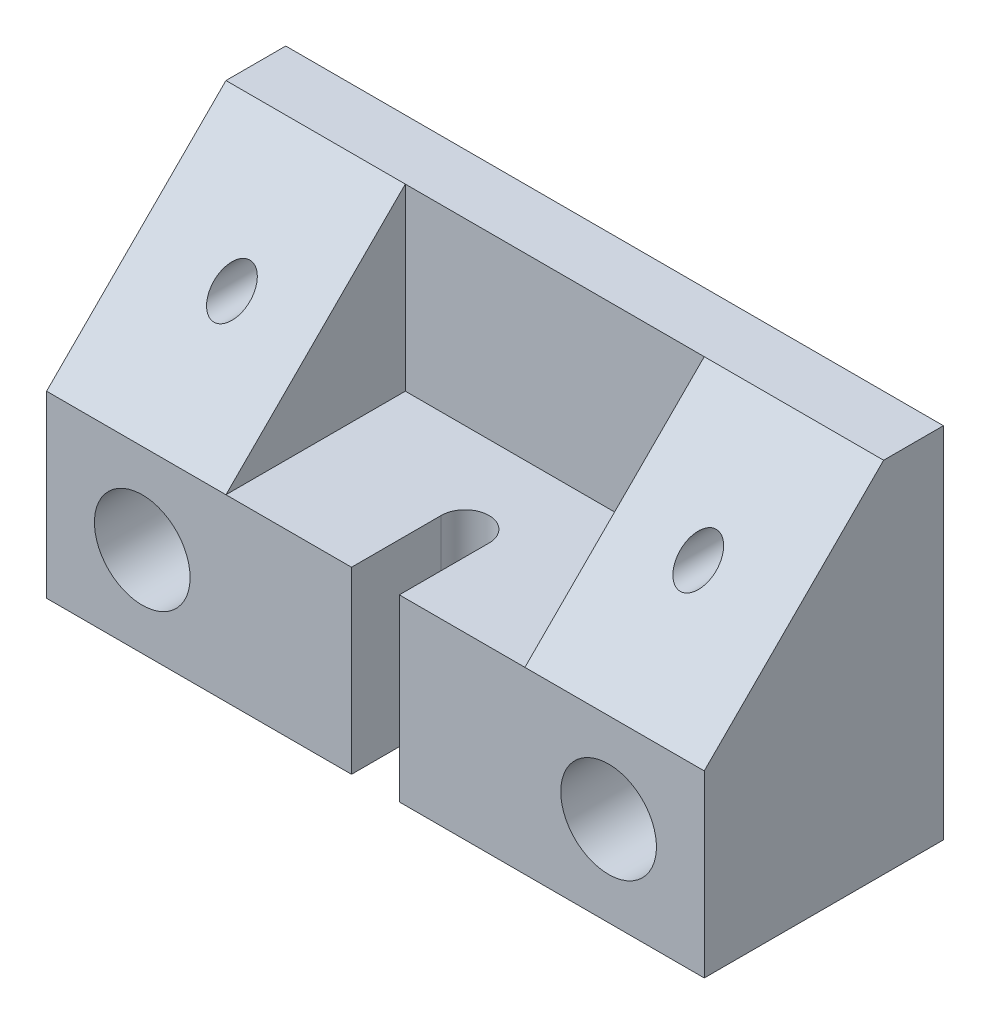
ISO-10303-21;
HEADER;
FILE_DESCRIPTION(('STEP AP214'),'2;1');
FILE_NAME('part.step','',(''),(''),'','','');
FILE_SCHEMA(('AUTOMOTIVE_DESIGN { 1 0 10303 214 1 1 1 1 }'));
ENDSEC;
DATA;
#1=APPLICATION_CONTEXT('core data for automotive mechanical design processes');
#2=APPLICATION_PROTOCOL_DEFINITION('international standard','automotive_design',2000,#1);
#3=PRODUCT_CONTEXT('',#1,'mechanical');
#4=PRODUCT('Part','Part','',(#3));
#5=PRODUCT_RELATED_PRODUCT_CATEGORY('part','',(#4));
#6=PRODUCT_DEFINITION_FORMATION('','',#4);
#7=PRODUCT_DEFINITION_CONTEXT('part definition',#1,'design');
#8=PRODUCT_DEFINITION('design','',#6,#7);
#9=PRODUCT_DEFINITION_SHAPE('','',#8);
#10=(LENGTH_UNIT() NAMED_UNIT(*) SI_UNIT(.MILLI.,.METRE.));
#11=(NAMED_UNIT(*) PLANE_ANGLE_UNIT() SI_UNIT($,.RADIAN.));
#12=(NAMED_UNIT(*) SI_UNIT($,.STERADIAN.) SOLID_ANGLE_UNIT());
#13=UNCERTAINTY_MEASURE_WITH_UNIT(LENGTH_MEASURE(1.E-05),#10,'distance_accuracy_value','');
#14=(GEOMETRIC_REPRESENTATION_CONTEXT(3) GLOBAL_UNCERTAINTY_ASSIGNED_CONTEXT((#13)) GLOBAL_UNIT_ASSIGNED_CONTEXT((#10,
#11,#12)) REPRESENTATION_CONTEXT('',''));
#15=CARTESIAN_POINT('',(0.,0.,0.));
#16=DIRECTION('',(0.,0.,1.));
#17=DIRECTION('',(1.,0.,0.));
#18=AXIS2_PLACEMENT_3D('',#15,#16,#17);
#19=CARTESIAN_POINT('',(0.,0.,0.2));
#20=DIRECTION('',(0.,0.,-1.));
#21=DIRECTION('',(-1.,0.,0.));
#22=AXIS2_PLACEMENT_3D('',#19,#20,#21);
#23=PLANE('',#22);
#24=CARTESIAN_POINT('',(0.0800000000000002,0.0750000000000008,0.2));
#25=DIRECTION('',(0.,0.,1.));
#26=DIRECTION('',(1.,0.,0.));
#27=AXIS2_PLACEMENT_3D('',#24,#25,#26);
#28=CIRCLE('',#27,0.0400000000000005);
#29=CARTESIAN_POINT('',(0.120000000000001,0.0750000000000008,0.2));
#30=VERTEX_POINT('',#29);
#31=EDGE_CURVE('E303',#30,#30,#28,.T.);
#32=ORIENTED_EDGE('',*,*,#31,.F.);
#33=EDGE_LOOP('',(#32));
#34=FACE_BOUND('',#33,.T.);
#35=DIRECTION('',(1.,0.,0.));
#36=VECTOR('',#35,1.);
#37=CARTESIAN_POINT('',(0.,0.,0.2));
#38=LINE('',#37,#36);
#39=CARTESIAN_POINT('',(0.,0.,0.2));
#40=VERTEX_POINT('',#39);
#41=CARTESIAN_POINT('',(0.254999999999999,0.,0.2));
#42=VERTEX_POINT('',#41);
#43=EDGE_CURVE('E197',#40,#42,#38,.T.);
#44=ORIENTED_EDGE('',*,*,#43,.T.);
#45=DIRECTION('',(0.,1.,0.));
#46=VECTOR('',#45,1.);
#47=CARTESIAN_POINT('',(0.254999999999999,0.,0.2));
#48=LINE('',#47,#46);
#49=CARTESIAN_POINT('',(0.254999999999999,0.150000000000002,0.200000000000002));
#50=VERTEX_POINT('',#49);
#51=EDGE_CURVE('E159',#42,#50,#48,.T.);
#52=ORIENTED_EDGE('',*,*,#51,.T.);
#53=DIRECTION('',(1.,0.,0.));
#54=VECTOR('',#53,1.);
#55=CARTESIAN_POINT('',(0.150000000000001,0.150000000000002,0.200000000000002));
#56=LINE('',#55,#54);
#57=CARTESIAN_POINT('',(0.150000000000001,0.150000000000002,0.200000000000002));
#58=VERTEX_POINT('',#57);
#59=EDGE_CURVE('E173',#58,#50,#56,.T.);
#60=ORIENTED_EDGE('',*,*,#59,.F.);
#61=DIRECTION('',(-1.,0.,0.));
#62=VECTOR('',#61,1.);
#63=CARTESIAN_POINT('',(0.551000000000002,0.150000000000002,0.2));
#64=LINE('',#63,#62);
#65=CARTESIAN_POINT('',(0.,0.150000000000002,0.2));
#66=VERTEX_POINT('',#65);
#67=EDGE_CURVE('E188',#58,#66,#64,.T.);
#68=ORIENTED_EDGE('',*,*,#67,.T.);
#69=DIRECTION('',(0.,-1.,0.));
#70=VECTOR('',#69,1.);
#71=CARTESIAN_POINT('',(0.,0.,0.2));
#72=LINE('',#71,#70);
#73=EDGE_CURVE('E194',#66,#40,#72,.T.);
#74=ORIENTED_EDGE('',*,*,#73,.T.);
#75=EDGE_LOOP('',(#44,#52,#60,#68,#74));
#76=FACE_BOUND('',#75,.T.);
#77=ADVANCED_FACE('F37',(#34,#76),#23,.F.);
#78=CARTESIAN_POINT('',(0.551000000000002,0.150000000000002,0.2));
#79=DIRECTION('',(0.,-0.707106781186564,-0.707106781186531));
#80=DIRECTION('',(0.,0.707106781186531,-0.707106781186564));
#81=AXIS2_PLACEMENT_3D('',#78,#79,#80);
#82=PLANE('',#81);
#83=CARTESIAN_POINT('',(0.470000000000002,0.225000000000002,0.124999999999996));
#84=DIRECTION('',(0.,-0.707106781186564,-0.707106781186531));
#85=DIRECTION('',(0.,-0.707106781186531,0.707106781186564));
#86=AXIS2_PLACEMENT_3D('',#83,#84,#85);
#87=ELLIPSE('',#86,0.0212132034355972,0.0150000000000002);
#88=CARTESIAN_POINT('',(0.470000000000002,0.210000000000002,0.139999999999997));
#89=VERTEX_POINT('',#88);
#90=EDGE_CURVE('E152',#89,#89,#87,.T.);
#91=ORIENTED_EDGE('',*,*,#90,.T.);
#92=EDGE_LOOP('',(#91));
#93=FACE_BOUND('',#92,.T.);
#94=DIRECTION('',(-1.,0.,0.));
#95=VECTOR('',#94,1.);
#96=CARTESIAN_POINT('',(0.551000000000002,0.300000000000002,0.0499999999999929));
#97=LINE('',#96,#95);
#98=CARTESIAN_POINT('',(0.55,0.300000000000002,0.0499999999999929));
#99=VERTEX_POINT('',#98);
#100=CARTESIAN_POINT('',(0.400000000000001,0.300000000000002,0.0499999999999929));
#101=VERTEX_POINT('',#100);
#102=EDGE_CURVE('E189',#99,#101,#97,.T.);
#103=ORIENTED_EDGE('',*,*,#102,.T.);
#104=DIRECTION('',(0.,-0.707106781186531,0.707106781186564));
#105=VECTOR('',#104,1.);
#106=CARTESIAN_POINT('',(0.400000000000001,0.150000000000002,0.2));
#107=LINE('',#106,#105);
#108=CARTESIAN_POINT('',(0.400000000000001,0.150000000000002,0.200000000000002));
#109=VERTEX_POINT('',#108);
#110=EDGE_CURVE('E46',#101,#109,#107,.T.);
#111=ORIENTED_EDGE('',*,*,#110,.T.);
#112=CARTESIAN_POINT('',(0.550000000000002,0.150000000000002,0.2));
#113=VERTEX_POINT('',#112);
#114=EDGE_CURVE('E184',#113,#109,#64,.T.);
#115=ORIENTED_EDGE('',*,*,#114,.F.);
#116=DIRECTION('',(0.,0.707106781186531,-0.707106781186564));
#117=VECTOR('',#116,1.);
#118=CARTESIAN_POINT('',(0.550000000000001,0.150000000000002,0.2));
#119=LINE('',#118,#117);
#120=EDGE_CURVE('E187',#113,#99,#119,.T.);
#121=ORIENTED_EDGE('',*,*,#120,.T.);
#122=EDGE_LOOP('',(#103,#111,#115,#121));
#123=FACE_BOUND('',#122,.T.);
#124=ADVANCED_FACE('F227',(#93,#123),#82,.F.);
#125=CARTESIAN_POINT('',(0.,0.,0.2));
#126=DIRECTION('',(1.,0.,0.));
#127=DIRECTION('',(0.,0.,-1.));
#128=AXIS2_PLACEMENT_3D('',#125,#126,#127);
#129=PLANE('',#128);
#130=ORIENTED_EDGE('',*,*,#73,.F.);
#131=DIRECTION('',(0.,-0.707106781186531,0.707106781186564));
#132=VECTOR('',#131,1.);
#133=CARTESIAN_POINT('',(0.,0.150000000000002,0.2));
#134=LINE('',#133,#132);
#135=CARTESIAN_POINT('',(0.,0.300000000000002,0.0499999999999929));
#136=VERTEX_POINT('',#135);
#137=EDGE_CURVE('E179',#136,#66,#134,.T.);
#138=ORIENTED_EDGE('',*,*,#137,.F.);
#139=DIRECTION('',(0.,0.,-1.));
#140=VECTOR('',#139,1.);
#141=CARTESIAN_POINT('',(0.,0.300000000000002,0.2));
#142=LINE('',#141,#140);
#143=CARTESIAN_POINT('',(0.,0.300000000000002,0.));
#144=VERTEX_POINT('',#143);
#145=EDGE_CURVE('E203',#136,#144,#142,.T.);
#146=ORIENTED_EDGE('',*,*,#145,.T.);
#147=DIRECTION('',(0.,-1.,0.));
#148=VECTOR('',#147,1.);
#149=CARTESIAN_POINT('',(0.,0.,0.));
#150=LINE('',#149,#148);
#151=CARTESIAN_POINT('',(0.,0.,0.));
#152=VERTEX_POINT('',#151);
#153=EDGE_CURVE('E193',#144,#152,#150,.T.);
#154=ORIENTED_EDGE('',*,*,#153,.T.);
#155=DIRECTION('',(0.,0.,-1.));
#156=VECTOR('',#155,1.);
#157=CARTESIAN_POINT('',(0.,0.,0.2));
#158=LINE('',#157,#156);
#159=EDGE_CURVE('E219',#40,#152,#158,.T.);
#160=ORIENTED_EDGE('',*,*,#159,.F.);
#161=EDGE_LOOP('',(#130,#138,#146,#154,#160));
#162=FACE_BOUND('',#161,.T.);
#163=ADVANCED_FACE('F39',(#162),#129,.F.);
#164=CARTESIAN_POINT('',(0.,0.,0.2));
#165=DIRECTION('',(0.,1.,0.));
#166=DIRECTION('',(0.,0.,1.));
#167=AXIS2_PLACEMENT_3D('',#164,#165,#166);
#168=PLANE('',#167);
#169=CARTESIAN_POINT('',(0.274999999999999,0.,0.125000000000002));
#170=DIRECTION('',(0.,1.,0.));
#171=DIRECTION('',(0.,0.,1.));
#172=AXIS2_PLACEMENT_3D('',#169,#170,#171);
#173=CIRCLE('',#172,0.02);
#174=CARTESIAN_POINT('',(0.294999999999999,0.,0.125000000000002));
#175=VERTEX_POINT('',#174);
#176=CARTESIAN_POINT('',(0.254999999999999,0.,0.125000000000002));
#177=VERTEX_POINT('',#176);
#178=EDGE_CURVE('E137',#175,#177,#173,.T.);
#179=ORIENTED_EDGE('',*,*,#178,.T.);
#180=DIRECTION('',(0.,0.,1.));
#181=VECTOR('',#180,1.);
#182=CARTESIAN_POINT('',(0.254999999999999,0.,0.275000000000003));
#183=LINE('',#182,#181);
#184=EDGE_CURVE('E134',#177,#42,#183,.T.);
#185=ORIENTED_EDGE('',*,*,#184,.T.);
#186=ORIENTED_EDGE('',*,*,#43,.F.);
#187=ORIENTED_EDGE('',*,*,#159,.T.);
#188=DIRECTION('',(1.,0.,0.));
#189=VECTOR('',#188,1.);
#190=CARTESIAN_POINT('',(0.,0.,0.));
#191=LINE('',#190,#189);
#192=CARTESIAN_POINT('',(0.550000000000002,0.,0.));
#193=VERTEX_POINT('',#192);
#194=EDGE_CURVE('E206',#152,#193,#191,.T.);
#195=ORIENTED_EDGE('',*,*,#194,.T.);
#196=DIRECTION('',(0.,0.,-1.));
#197=VECTOR('',#196,1.);
#198=CARTESIAN_POINT('',(0.550000000000002,0.,0.2));
#199=LINE('',#198,#197);
#200=CARTESIAN_POINT('',(0.550000000000002,0.,0.2));
#201=VERTEX_POINT('',#200);
#202=EDGE_CURVE('E216',#201,#193,#199,.T.);
#203=ORIENTED_EDGE('',*,*,#202,.F.);
#204=CARTESIAN_POINT('',(0.294999999999999,0.,0.2));
#205=VERTEX_POINT('',#204);
#206=EDGE_CURVE('E146',#205,#201,#38,.T.);
#207=ORIENTED_EDGE('',*,*,#206,.F.);
#208=DIRECTION('',(0.,0.,-1.));
#209=VECTOR('',#208,1.);
#210=CARTESIAN_POINT('',(0.294999999999999,0.,0.275000000000003));
#211=LINE('',#210,#209);
#212=EDGE_CURVE('E129',#205,#175,#211,.T.);
#213=ORIENTED_EDGE('',*,*,#212,.T.);
#214=EDGE_LOOP('',(#179,#185,#186,#187,#195,#203,#207,#213));
#215=FACE_BOUND('',#214,.T.);
#216=ADVANCED_FACE('F144',(#215),#168,.F.);
#217=CARTESIAN_POINT('',(0.550000000000002,0.,0.2));
#218=DIRECTION('',(-1.,0.,0.));
#219=DIRECTION('',(0.,-1.,0.));
#220=AXIS2_PLACEMENT_3D('',#217,#218,#219);
#221=PLANE('',#220);
#222=DIRECTION('',(0.,0.,-1.));
#223=VECTOR('',#222,1.);
#224=CARTESIAN_POINT('',(0.55,0.300000000000002,0.2));
#225=LINE('',#224,#223);
#226=CARTESIAN_POINT('',(0.55,0.300000000000002,0.));
#227=VERTEX_POINT('',#226);
#228=EDGE_CURVE('E214',#99,#227,#225,.T.);
#229=ORIENTED_EDGE('',*,*,#228,.F.);
#230=ORIENTED_EDGE('',*,*,#120,.F.);
#231=DIRECTION('',(0.,1.,0.));
#232=VECTOR('',#231,1.);
#233=CARTESIAN_POINT('',(0.550000000000002,0.,0.2));
#234=LINE('',#233,#232);
#235=EDGE_CURVE('E200',#201,#113,#234,.T.);
#236=ORIENTED_EDGE('',*,*,#235,.F.);
#237=ORIENTED_EDGE('',*,*,#202,.T.);
#238=DIRECTION('',(0.,1.,0.));
#239=VECTOR('',#238,1.);
#240=CARTESIAN_POINT('',(0.550000000000002,0.,0.));
#241=LINE('',#240,#239);
#242=EDGE_CURVE('E208',#193,#227,#241,.T.);
#243=ORIENTED_EDGE('',*,*,#242,.T.);
#244=EDGE_LOOP('',(#229,#230,#236,#237,#243));
#245=FACE_BOUND('',#244,.T.);
#246=ADVANCED_FACE('F239',(#245),#221,.F.);
#247=CARTESIAN_POINT('',(0.,0.300000000000002,0.2));
#248=DIRECTION('',(0.,-1.,0.));
#249=DIRECTION('',(0.,0.,-1.));
#250=AXIS2_PLACEMENT_3D('',#247,#248,#249);
#251=PLANE('',#250);
#252=ORIENTED_EDGE('',*,*,#145,.F.);
#253=CARTESIAN_POINT('',(0.150000000000001,0.300000000000002,0.0499999999999929));
#254=VERTEX_POINT('',#253);
#255=EDGE_CURVE('E183',#254,#136,#97,.T.);
#256=ORIENTED_EDGE('',*,*,#255,.F.);
#257=DIRECTION('',(-1.,0.,0.));
#258=VECTOR('',#257,1.);
#259=CARTESIAN_POINT('',(0.150000000000001,0.300000000000002,0.0499999999999929));
#260=LINE('',#259,#258);
#261=EDGE_CURVE('E162',#101,#254,#260,.T.);
#262=ORIENTED_EDGE('',*,*,#261,.F.);
#263=ORIENTED_EDGE('',*,*,#102,.F.);
#264=ORIENTED_EDGE('',*,*,#228,.T.);
#265=DIRECTION('',(-1.,0.,0.));
#266=VECTOR('',#265,1.);
#267=CARTESIAN_POINT('',(0.,0.300000000000002,0.));
#268=LINE('',#267,#266);
#269=EDGE_CURVE('E196',#227,#144,#268,.T.);
#270=ORIENTED_EDGE('',*,*,#269,.T.);
#271=EDGE_LOOP('',(#252,#256,#262,#263,#264,#270));
#272=FACE_BOUND('',#271,.T.);
#273=ADVANCED_FACE('F243',(#272),#251,.F.);
#274=CARTESIAN_POINT('',(0.470000000000002,0.0750000000000009,0.2));
#275=DIRECTION('',(0.,0.,1.));
#276=DIRECTION('',(-1.,0.,0.));
#277=AXIS2_PLACEMENT_3D('',#274,#275,#276);
#278=CIRCLE('',#277,0.0400000000000004);
#279=CARTESIAN_POINT('',(0.430000000000001,0.0750000000000009,0.2));
#280=VERTEX_POINT('',#279);
#281=EDGE_CURVE('E289',#280,#280,#278,.T.);
#282=ORIENTED_EDGE('',*,*,#281,.F.);
#283=EDGE_LOOP('',(#282));
#284=FACE_BOUND('',#283,.T.);
#285=CARTESIAN_POINT('',(0.294999999999999,0.150000000000002,0.200000000000002));
#286=VERTEX_POINT('',#285);
#287=EDGE_CURVE('E172',#286,#109,#56,.T.);
#288=ORIENTED_EDGE('',*,*,#287,.F.);
#289=DIRECTION('',(0.,-1.,0.));
#290=VECTOR('',#289,1.);
#291=CARTESIAN_POINT('',(0.294999999999999,0.,0.2));
#292=LINE('',#291,#290);
#293=EDGE_CURVE('E53',#286,#205,#292,.T.);
#294=ORIENTED_EDGE('',*,*,#293,.T.);
#295=ORIENTED_EDGE('',*,*,#206,.T.);
#296=ORIENTED_EDGE('',*,*,#235,.T.);
#297=ORIENTED_EDGE('',*,*,#114,.T.);
#298=EDGE_LOOP('',(#288,#294,#295,#296,#297));
#299=FACE_BOUND('',#298,.T.);
#300=ADVANCED_FACE('F235',(#284,#299),#23,.F.);
#301=CARTESIAN_POINT('',(0.,0.,0.));
#302=DIRECTION('',(0.,0.,-1.));
#303=DIRECTION('',(-1.,0.,0.));
#304=AXIS2_PLACEMENT_3D('',#301,#302,#303);
#305=PLANE('',#304);
#306=CARTESIAN_POINT('',(0.0800000000000002,0.225000000000002,0.));
#307=DIRECTION('',(0.,0.,1.));
#308=DIRECTION('',(1.,0.,0.));
#309=AXIS2_PLACEMENT_3D('',#306,#307,#308);
#310=CIRCLE('',#309,0.0150000000000001);
#311=CARTESIAN_POINT('',(0.0950000000000003,0.225000000000002,0.));
#312=VERTEX_POINT('',#311);
#313=EDGE_CURVE('E295',#312,#312,#310,.T.);
#314=ORIENTED_EDGE('',*,*,#313,.T.);
#315=EDGE_LOOP('',(#314));
#316=FACE_BOUND('',#315,.T.);
#317=CARTESIAN_POINT('',(0.470000000000002,0.0750000000000009,0.));
#318=DIRECTION('',(0.,0.,1.));
#319=DIRECTION('',(-1.,0.,0.));
#320=AXIS2_PLACEMENT_3D('',#317,#318,#319);
#321=CIRCLE('',#320,0.0400000000000004);
#322=CARTESIAN_POINT('',(0.430000000000001,0.0750000000000009,0.));
#323=VERTEX_POINT('',#322);
#324=EDGE_CURVE('E291',#323,#323,#321,.T.);
#325=ORIENTED_EDGE('',*,*,#324,.T.);
#326=EDGE_LOOP('',(#325));
#327=FACE_BOUND('',#326,.T.);
#328=CARTESIAN_POINT('',(0.470000000000002,0.225000000000002,0.));
#329=DIRECTION('',(0.,0.,1.));
#330=DIRECTION('',(-1.,0.,0.));
#331=AXIS2_PLACEMENT_3D('',#328,#329,#330);
#332=CIRCLE('',#331,0.0150000000000002);
#333=CARTESIAN_POINT('',(0.455000000000001,0.225000000000002,0.));
#334=VERTEX_POINT('',#333);
#335=EDGE_CURVE('E292',#334,#334,#332,.T.);
#336=ORIENTED_EDGE('',*,*,#335,.T.);
#337=EDGE_LOOP('',(#336));
#338=FACE_BOUND('',#337,.T.);
#339=CARTESIAN_POINT('',(0.0800000000000002,0.0750000000000008,0.));
#340=DIRECTION('',(0.,0.,1.));
#341=DIRECTION('',(1.,0.,0.));
#342=AXIS2_PLACEMENT_3D('',#339,#340,#341);
#343=CIRCLE('',#342,0.0400000000000005);
#344=CARTESIAN_POINT('',(0.120000000000001,0.0750000000000008,0.));
#345=VERTEX_POINT('',#344);
#346=EDGE_CURVE('E301',#345,#345,#343,.T.);
#347=ORIENTED_EDGE('',*,*,#346,.T.);
#348=EDGE_LOOP('',(#347));
#349=FACE_BOUND('',#348,.T.);
#350=ORIENTED_EDGE('',*,*,#153,.F.);
#351=ORIENTED_EDGE('',*,*,#269,.F.);
#352=ORIENTED_EDGE('',*,*,#242,.F.);
#353=ORIENTED_EDGE('',*,*,#194,.F.);
#354=EDGE_LOOP('',(#350,#351,#352,#353));
#355=FACE_BOUND('',#354,.T.);
#356=ADVANCED_FACE('F265',(#316,#327,#338,#349,#355),#305,.T.);
#357=CARTESIAN_POINT('',(0.0800000000000002,0.225000000000002,0.124999999999996));
#358=DIRECTION('',(0.,-0.707106781186564,-0.707106781186531));
#359=DIRECTION('',(0.,-0.707106781186531,0.707106781186564));
#360=AXIS2_PLACEMENT_3D('',#357,#358,#359);
#361=ELLIPSE('',#360,0.0212132034355971,0.0150000000000001);
#362=CARTESIAN_POINT('',(0.0800000000000002,0.210000000000002,0.139999999999997));
#363=VERTEX_POINT('',#362);
#364=EDGE_CURVE('E41',#363,#363,#361,.T.);
#365=ORIENTED_EDGE('',*,*,#364,.T.);
#366=EDGE_LOOP('',(#365));
#367=FACE_BOUND('',#366,.T.);
#368=ORIENTED_EDGE('',*,*,#67,.F.);
#369=DIRECTION('',(0.,0.707106781186531,-0.707106781186564));
#370=VECTOR('',#369,1.);
#371=CARTESIAN_POINT('',(0.150000000000001,0.150000000000002,0.2));
#372=LINE('',#371,#370);
#373=EDGE_CURVE('E222',#58,#254,#372,.T.);
#374=ORIENTED_EDGE('',*,*,#373,.T.);
#375=ORIENTED_EDGE('',*,*,#255,.T.);
#376=ORIENTED_EDGE('',*,*,#137,.T.);
#377=EDGE_LOOP('',(#368,#374,#375,#376));
#378=FACE_BOUND('',#377,.T.);
#379=ADVANCED_FACE('F249',(#367,#378),#82,.F.);
#380=CARTESIAN_POINT('',(0.400000000000001,0.150000000000002,0.200000000000002));
#381=DIRECTION('',(1.,0.,0.));
#382=DIRECTION('',(0.,0.,-1.));
#383=AXIS2_PLACEMENT_3D('',#380,#381,#382);
#384=PLANE('',#383);
#385=DIRECTION('',(0.,1.,0.));
#386=VECTOR('',#385,1.);
#387=CARTESIAN_POINT('',(0.400000000000001,0.150000000000002,0.0499999999999929));
#388=LINE('',#387,#386);
#389=CARTESIAN_POINT('',(0.400000000000001,0.150000000000002,0.0499999999999929));
#390=VERTEX_POINT('',#389);
#391=EDGE_CURVE('E60',#390,#101,#388,.T.);
#392=ORIENTED_EDGE('',*,*,#391,.F.);
#393=DIRECTION('',(0.,0.,-1.));
#394=VECTOR('',#393,1.);
#395=CARTESIAN_POINT('',(0.400000000000001,0.150000000000002,0.200000000000002));
#396=LINE('',#395,#394);
#397=EDGE_CURVE('E163',#109,#390,#396,.T.);
#398=ORIENTED_EDGE('',*,*,#397,.F.);
#399=ORIENTED_EDGE('',*,*,#110,.F.);
#400=EDGE_LOOP('',(#392,#398,#399));
#401=FACE_BOUND('',#400,.T.);
#402=ADVANCED_FACE('F257',(#401),#384,.F.);
#403=CARTESIAN_POINT('',(0.150000000000001,0.150000000000002,0.200000000000002));
#404=DIRECTION('',(-1.,0.,0.));
#405=DIRECTION('',(0.,0.,1.));
#406=AXIS2_PLACEMENT_3D('',#403,#404,#405);
#407=PLANE('',#406);
#408=DIRECTION('',(0.,0.,1.));
#409=VECTOR('',#408,1.);
#410=CARTESIAN_POINT('',(0.150000000000001,0.150000000000002,0.200000000000002));
#411=LINE('',#410,#409);
#412=CARTESIAN_POINT('',(0.150000000000001,0.150000000000002,0.0499999999999929));
#413=VERTEX_POINT('',#412);
#414=EDGE_CURVE('E169',#413,#58,#411,.T.);
#415=ORIENTED_EDGE('',*,*,#414,.F.);
#416=DIRECTION('',(0.,1.,0.));
#417=VECTOR('',#416,1.);
#418=CARTESIAN_POINT('',(0.150000000000001,0.150000000000002,0.0499999999999929));
#419=LINE('',#418,#417);
#420=EDGE_CURVE('E177',#413,#254,#419,.T.);
#421=ORIENTED_EDGE('',*,*,#420,.T.);
#422=ORIENTED_EDGE('',*,*,#373,.F.);
#423=EDGE_LOOP('',(#415,#421,#422));
#424=FACE_BOUND('',#423,.T.);
#425=ADVANCED_FACE('F253',(#424),#407,.F.);
#426=CARTESIAN_POINT('',(0.150000000000001,0.150000000000002,0.0499999999999929));
#427=DIRECTION('',(0.,0.,-1.));
#428=DIRECTION('',(-1.,0.,0.));
#429=AXIS2_PLACEMENT_3D('',#426,#427,#428);
#430=PLANE('',#429);
#431=ORIENTED_EDGE('',*,*,#261,.T.);
#432=ORIENTED_EDGE('',*,*,#420,.F.);
#433=DIRECTION('',(-1.,0.,0.));
#434=VECTOR('',#433,1.);
#435=CARTESIAN_POINT('',(0.150000000000001,0.150000000000002,0.0499999999999929));
#436=LINE('',#435,#434);
#437=EDGE_CURVE('E166',#390,#413,#436,.T.);
#438=ORIENTED_EDGE('',*,*,#437,.F.);
#439=ORIENTED_EDGE('',*,*,#391,.T.);
#440=EDGE_LOOP('',(#431,#432,#438,#439));
#441=FACE_BOUND('',#440,.T.);
#442=ADVANCED_FACE('F245',(#441),#430,.F.);
#443=CARTESIAN_POINT('',(0.,0.150000000000002,0.));
#444=DIRECTION('',(0.,-1.,0.));
#445=DIRECTION('',(0.,0.,-1.));
#446=AXIS2_PLACEMENT_3D('',#443,#444,#445);
#447=PLANE('',#446);
#448=ORIENTED_EDGE('',*,*,#59,.T.);
#449=DIRECTION('',(0.,0.,1.));
#450=VECTOR('',#449,1.);
#451=CARTESIAN_POINT('',(0.254999999999999,0.150000000000002,0.275000000000003));
#452=LINE('',#451,#450);
#453=CARTESIAN_POINT('',(0.254999999999999,0.150000000000002,0.125000000000002));
#454=VERTEX_POINT('',#453);
#455=EDGE_CURVE('E147',#454,#50,#452,.T.);
#456=ORIENTED_EDGE('',*,*,#455,.F.);
#457=CARTESIAN_POINT('',(0.274999999999999,0.150000000000002,0.125000000000002));
#458=DIRECTION('',(0.,1.,0.));
#459=DIRECTION('',(0.,0.,1.));
#460=AXIS2_PLACEMENT_3D('',#457,#458,#459);
#461=CIRCLE('',#460,0.02);
#462=CARTESIAN_POINT('',(0.294999999999999,0.150000000000002,0.125000000000002));
#463=VERTEX_POINT('',#462);
#464=EDGE_CURVE('E149',#463,#454,#461,.T.);
#465=ORIENTED_EDGE('',*,*,#464,.F.);
#466=DIRECTION('',(0.,0.,1.));
#467=VECTOR('',#466,1.);
#468=CARTESIAN_POINT('',(0.294999999999999,0.150000000000002,0.));
#469=LINE('',#468,#467);
#470=EDGE_CURVE('E11',#463,#286,#469,.T.);
#471=ORIENTED_EDGE('',*,*,#470,.T.);
#472=ORIENTED_EDGE('',*,*,#287,.T.);
#473=ORIENTED_EDGE('',*,*,#397,.T.);
#474=ORIENTED_EDGE('',*,*,#437,.T.);
#475=ORIENTED_EDGE('',*,*,#414,.T.);
#476=EDGE_LOOP('',(#448,#456,#465,#471,#472,#473,#474,#475));
#477=FACE_BOUND('',#476,.T.);
#478=ADVANCED_FACE('F255',(#477),#447,.F.);
#479=CARTESIAN_POINT('',(0.254999999999999,0.,0.275000000000003));
#480=DIRECTION('',(-1.,0.,0.));
#481=DIRECTION('',(0.,0.,1.));
#482=AXIS2_PLACEMENT_3D('',#479,#480,#481);
#483=PLANE('',#482);
#484=ORIENTED_EDGE('',*,*,#184,.F.);
#485=DIRECTION('',(0.,1.,0.));
#486=VECTOR('',#485,1.);
#487=CARTESIAN_POINT('',(0.254999999999999,0.,0.125000000000002));
#488=LINE('',#487,#486);
#489=EDGE_CURVE('E133',#177,#454,#488,.T.);
#490=ORIENTED_EDGE('',*,*,#489,.T.);
#491=ORIENTED_EDGE('',*,*,#455,.T.);
#492=ORIENTED_EDGE('',*,*,#51,.F.);
#493=EDGE_LOOP('',(#484,#490,#491,#492));
#494=FACE_BOUND('',#493,.T.);
#495=ADVANCED_FACE('F335',(#494),#483,.F.);
#496=CARTESIAN_POINT('',(0.294999999999999,0.,0.275000000000003));
#497=DIRECTION('',(1.,0.,0.));
#498=DIRECTION('',(0.,0.,-1.));
#499=AXIS2_PLACEMENT_3D('',#496,#497,#498);
#500=PLANE('',#499);
#501=ORIENTED_EDGE('',*,*,#470,.F.);
#502=DIRECTION('',(0.,1.,0.));
#503=VECTOR('',#502,1.);
#504=CARTESIAN_POINT('',(0.294999999999999,0.,0.125000000000002));
#505=LINE('',#504,#503);
#506=EDGE_CURVE('E125',#175,#463,#505,.T.);
#507=ORIENTED_EDGE('',*,*,#506,.F.);
#508=ORIENTED_EDGE('',*,*,#212,.F.);
#509=ORIENTED_EDGE('',*,*,#293,.F.);
#510=EDGE_LOOP('',(#501,#507,#508,#509));
#511=FACE_BOUND('',#510,.T.);
#512=ADVANCED_FACE('F127',(#511),#500,.F.);
#513=CARTESIAN_POINT('',(0.274999999999999,0.,0.125000000000002));
#514=DIRECTION('',(0.,1.,0.));
#515=DIRECTION('',(0.,0.,1.));
#516=AXIS2_PLACEMENT_3D('',#513,#514,#515);
#517=CYLINDRICAL_SURFACE('',#516,0.02);
#518=ORIENTED_EDGE('',*,*,#464,.T.);
#519=ORIENTED_EDGE('',*,*,#489,.F.);
#520=ORIENTED_EDGE('',*,*,#178,.F.);
#521=ORIENTED_EDGE('',*,*,#506,.T.);
#522=EDGE_LOOP('',(#518,#519,#520,#521));
#523=FACE_BOUND('',#522,.T.);
#524=ADVANCED_FACE('F138',(#523),#517,.F.);
#525=CARTESIAN_POINT('',(0.0800000000000002,0.225000000000002,0.));
#526=DIRECTION('',(0.,0.,1.));
#527=DIRECTION('',(1.,0.,0.));
#528=AXIS2_PLACEMENT_3D('',#525,#526,#527);
#529=CYLINDRICAL_SURFACE('',#528,0.0150000000000001);
#530=ORIENTED_EDGE('',*,*,#313,.F.);
#531=EDGE_LOOP('',(#530));
#532=FACE_BOUND('',#531,.T.);
#533=ORIENTED_EDGE('',*,*,#364,.F.);
#534=EDGE_LOOP('',(#533));
#535=FACE_BOUND('',#534,.T.);
#536=ADVANCED_FACE('F310',(#532,#535),#529,.F.);
#537=CARTESIAN_POINT('',(0.0800000000000002,0.0750000000000008,0.));
#538=DIRECTION('',(0.,0.,1.));
#539=DIRECTION('',(1.,0.,0.));
#540=AXIS2_PLACEMENT_3D('',#537,#538,#539);
#541=CYLINDRICAL_SURFACE('',#540,0.0400000000000005);
#542=ORIENTED_EDGE('',*,*,#346,.F.);
#543=EDGE_LOOP('',(#542));
#544=FACE_BOUND('',#543,.T.);
#545=ORIENTED_EDGE('',*,*,#31,.T.);
#546=EDGE_LOOP('',(#545));
#547=FACE_BOUND('',#546,.T.);
#548=ADVANCED_FACE('F313',(#544,#547),#541,.F.);
#549=CARTESIAN_POINT('',(0.470000000000002,0.225000000000002,0.));
#550=DIRECTION('',(0.,0.,1.));
#551=DIRECTION('',(1.,0.,0.));
#552=AXIS2_PLACEMENT_3D('',#549,#550,#551);
#553=CYLINDRICAL_SURFACE('',#552,0.0150000000000002);
#554=ORIENTED_EDGE('',*,*,#335,.F.);
#555=EDGE_LOOP('',(#554));
#556=FACE_BOUND('',#555,.T.);
#557=ORIENTED_EDGE('',*,*,#90,.F.);
#558=EDGE_LOOP('',(#557));
#559=FACE_BOUND('',#558,.T.);
#560=ADVANCED_FACE('F320',(#556,#559),#553,.F.);
#561=CARTESIAN_POINT('',(0.470000000000002,0.0750000000000009,0.));
#562=DIRECTION('',(0.,0.,1.));
#563=DIRECTION('',(1.,0.,0.));
#564=AXIS2_PLACEMENT_3D('',#561,#562,#563);
#565=CYLINDRICAL_SURFACE('',#564,0.0400000000000004);
#566=ORIENTED_EDGE('',*,*,#324,.F.);
#567=EDGE_LOOP('',(#566));
#568=FACE_BOUND('',#567,.T.);
#569=ORIENTED_EDGE('',*,*,#281,.T.);
#570=EDGE_LOOP('',(#569));
#571=FACE_BOUND('',#570,.T.);
#572=ADVANCED_FACE('F322',(#568,#571),#565,.F.);
#573=CLOSED_SHELL('',(#77,#124,#163,#216,#246,#273,#300,#356,#379,#402,#425,#442,#478,#495,#512,
#524,#536,#548,#560,#572));
#574=MANIFOLD_SOLID_BREP('B2',#573);
#575=ADVANCED_BREP_SHAPE_REPRESENTATION('',(#18,#574),#14);
#576=SHAPE_DEFINITION_REPRESENTATION(#9,#575);
ENDSEC;
END-ISO-10303-21;
